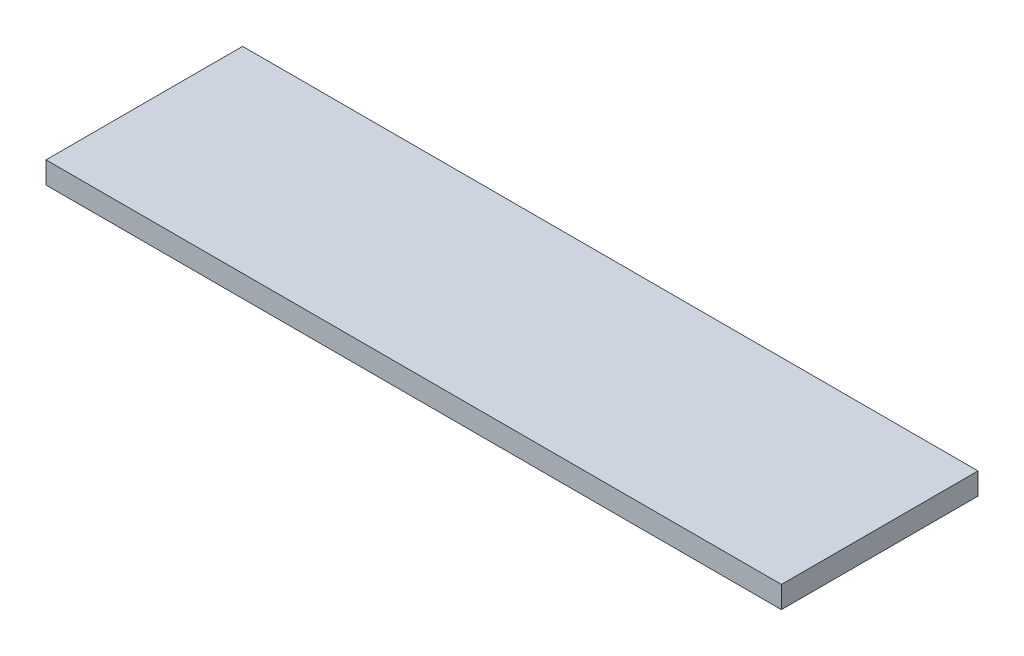
ISO-10303-21;
HEADER;
FILE_DESCRIPTION(('STEP AP214'),'2;1');
FILE_NAME('part.step','',(''),(''),'','','');
FILE_SCHEMA(('AUTOMOTIVE_DESIGN { 1 0 10303 214 1 1 1 1 }'));
ENDSEC;
DATA;
#1=APPLICATION_CONTEXT('core data for automotive mechanical design processes');
#2=APPLICATION_PROTOCOL_DEFINITION('international standard','automotive_design',2000,#1);
#3=PRODUCT_CONTEXT('',#1,'mechanical');
#4=PRODUCT('Part','Part','',(#3));
#5=PRODUCT_RELATED_PRODUCT_CATEGORY('part','',(#4));
#6=PRODUCT_DEFINITION_FORMATION('','',#4);
#7=PRODUCT_DEFINITION_CONTEXT('part definition',#1,'design');
#8=PRODUCT_DEFINITION('design','',#6,#7);
#9=PRODUCT_DEFINITION_SHAPE('','',#8);
#10=(LENGTH_UNIT() NAMED_UNIT(*) SI_UNIT(.MILLI.,.METRE.));
#11=(NAMED_UNIT(*) PLANE_ANGLE_UNIT() SI_UNIT($,.RADIAN.));
#12=(NAMED_UNIT(*) SI_UNIT($,.STERADIAN.) SOLID_ANGLE_UNIT());
#13=UNCERTAINTY_MEASURE_WITH_UNIT(LENGTH_MEASURE(1.E-05),#10,'distance_accuracy_value','');
#14=(GEOMETRIC_REPRESENTATION_CONTEXT(3) GLOBAL_UNCERTAINTY_ASSIGNED_CONTEXT((#13)) GLOBAL_UNIT_ASSIGNED_CONTEXT((#10,
#11,#12)) REPRESENTATION_CONTEXT('',''));
#15=CARTESIAN_POINT('',(0.,0.,0.));
#16=DIRECTION('',(0.,0.,1.));
#17=DIRECTION('',(1.,0.,0.));
#18=AXIS2_PLACEMENT_3D('',#15,#16,#17);
#19=CARTESIAN_POINT('',(1.294995954824,0.644997128945,0.));
#20=DIRECTION('',(1.,0.,0.));
#21=DIRECTION('',(0.,1.,0.));
#22=AXIS2_PLACEMENT_3D('',#19,#20,#21);
#23=PLANE('',#22);
#24=DIRECTION('',(0.,-1.,0.));
#25=VECTOR('',#24,1.);
#26=CARTESIAN_POINT('',(1.294995954824,0.644997128945,0.));
#27=LINE('',#26,#25);
#28=CARTESIAN_POINT('',(1.294995954824,0.644997128945,0.));
#29=VERTEX_POINT('',#28);
#30=CARTESIAN_POINT('',(1.294995954824,0.344997728945,0.));
#31=VERTEX_POINT('',#30);
#32=EDGE_CURVE('E11',#29,#31,#27,.T.);
#33=ORIENTED_EDGE('',*,*,#32,.T.);
#34=DIRECTION('',(0.,0.,1.));
#35=VECTOR('',#34,1.);
#36=CARTESIAN_POINT('',(1.294995954824,0.344997728945,0.));
#37=LINE('',#36,#35);
#38=CARTESIAN_POINT('',(1.294995954824,0.344997728945,2.69999968));
#39=VERTEX_POINT('',#38);
#40=EDGE_CURVE('E25',#31,#39,#37,.T.);
#41=ORIENTED_EDGE('',*,*,#40,.T.);
#42=DIRECTION('',(0.,-1.,0.));
#43=VECTOR('',#42,1.);
#44=CARTESIAN_POINT('',(1.294995954824,0.644997128945,2.69999968));
#45=LINE('',#44,#43);
#46=CARTESIAN_POINT('',(1.294995954824,0.644997128945,2.69999968));
#47=VERTEX_POINT('',#46);
#48=EDGE_CURVE('E106',#47,#39,#45,.T.);
#49=ORIENTED_EDGE('',*,*,#48,.F.);
#50=DIRECTION('',(0.,0.,1.));
#51=VECTOR('',#50,1.);
#52=CARTESIAN_POINT('',(1.294995954824,0.644997128945,0.));
#53=LINE('',#52,#51);
#54=EDGE_CURVE('E87',#29,#47,#53,.T.);
#55=ORIENTED_EDGE('',*,*,#54,.F.);
#56=EDGE_LOOP('',(#33,#41,#49,#55));
#57=FACE_BOUND('',#56,.T.);
#58=ADVANCED_FACE('F17',(#57),#23,.F.);
#59=CARTESIAN_POINT('',(1.294995954824,0.344997728945,0.));
#60=DIRECTION('',(0.,1.,0.));
#61=DIRECTION('',(1.,0.,0.));
#62=AXIS2_PLACEMENT_3D('',#59,#60,#61);
#63=PLANE('',#62);
#64=DIRECTION('',(1.,0.,0.));
#65=VECTOR('',#64,1.);
#66=CARTESIAN_POINT('',(1.294995954824,0.344997728945,0.));
#67=LINE('',#66,#65);
#68=CARTESIAN_POINT('',(11.394998614824,0.344997728945,0.));
#69=VERTEX_POINT('',#68);
#70=EDGE_CURVE('E101',#31,#69,#67,.T.);
#71=ORIENTED_EDGE('',*,*,#70,.T.);
#72=DIRECTION('',(0.,0.,1.));
#73=VECTOR('',#72,1.);
#74=CARTESIAN_POINT('',(11.394998614824,0.344997728945,0.));
#75=LINE('',#74,#73);
#76=CARTESIAN_POINT('',(11.394998614824,0.344997728945,2.69999968));
#77=VERTEX_POINT('',#76);
#78=EDGE_CURVE('E98',#69,#77,#75,.T.);
#79=ORIENTED_EDGE('',*,*,#78,.T.);
#80=DIRECTION('',(1.,0.,0.));
#81=VECTOR('',#80,1.);
#82=CARTESIAN_POINT('',(1.294995954824,0.344997728945,2.69999968));
#83=LINE('',#82,#81);
#84=EDGE_CURVE('E81',#39,#77,#83,.T.);
#85=ORIENTED_EDGE('',*,*,#84,.F.);
#86=ORIENTED_EDGE('',*,*,#40,.F.);
#87=EDGE_LOOP('',(#71,#79,#85,#86));
#88=FACE_BOUND('',#87,.T.);
#89=ADVANCED_FACE('F109',(#88),#63,.F.);
#90=CARTESIAN_POINT('',(11.394998614824,0.344997728945,0.));
#91=DIRECTION('',(-1.,0.,0.));
#92=DIRECTION('',(0.,0.,1.));
#93=AXIS2_PLACEMENT_3D('',#90,#91,#92);
#94=PLANE('',#93);
#95=DIRECTION('',(0.,1.,0.));
#96=VECTOR('',#95,1.);
#97=CARTESIAN_POINT('',(11.394998614824,0.344997728945,0.));
#98=LINE('',#97,#96);
#99=CARTESIAN_POINT('',(11.394998614824,0.644999668945,0.));
#100=VERTEX_POINT('',#99);
#101=EDGE_CURVE('E68',#69,#100,#98,.T.);
#102=ORIENTED_EDGE('',*,*,#101,.T.);
#103=DIRECTION('',(0.,0.,1.));
#104=VECTOR('',#103,1.);
#105=CARTESIAN_POINT('',(11.394998614824,0.644999668945,0.));
#106=LINE('',#105,#104);
#107=CARTESIAN_POINT('',(11.394998614824,0.644999668945,2.69999968));
#108=VERTEX_POINT('',#107);
#109=EDGE_CURVE('E62',#100,#108,#106,.T.);
#110=ORIENTED_EDGE('',*,*,#109,.T.);
#111=DIRECTION('',(0.,1.,0.));
#112=VECTOR('',#111,1.);
#113=CARTESIAN_POINT('',(11.394998614824,0.344997728945,2.69999968));
#114=LINE('',#113,#112);
#115=EDGE_CURVE('E66',#77,#108,#114,.T.);
#116=ORIENTED_EDGE('',*,*,#115,.F.);
#117=ORIENTED_EDGE('',*,*,#78,.F.);
#118=EDGE_LOOP('',(#102,#110,#116,#117));
#119=FACE_BOUND('',#118,.T.);
#120=ADVANCED_FACE('F64',(#119),#94,.F.);
#121=CARTESIAN_POINT('',(11.394998614824,0.644999668945,0.));
#122=DIRECTION('',(2.51485082336592E-07,-0.999999999999968,0.));
#123=DIRECTION('',(0.,0.,-1.));
#124=AXIS2_PLACEMENT_3D('',#121,#122,#123);
#125=PLANE('',#124);
#126=DIRECTION('',(-0.999999999999968,-2.51485082336592E-07,0.));
#127=VECTOR('',#126,1.);
#128=CARTESIAN_POINT('',(11.394998614824,0.644999668945,0.));
#129=LINE('',#128,#127);
#130=EDGE_CURVE('E83',#100,#29,#129,.T.);
#131=ORIENTED_EDGE('',*,*,#130,.T.);
#132=ORIENTED_EDGE('',*,*,#54,.T.);
#133=DIRECTION('',(-0.999999999999968,-2.51485082336592E-07,0.));
#134=VECTOR('',#133,1.);
#135=CARTESIAN_POINT('',(11.394998614824,0.644999668945,2.69999968));
#136=LINE('',#135,#134);
#137=EDGE_CURVE('E79',#108,#47,#136,.T.);
#138=ORIENTED_EDGE('',*,*,#137,.F.);
#139=ORIENTED_EDGE('',*,*,#109,.F.);
#140=EDGE_LOOP('',(#131,#132,#138,#139));
#141=FACE_BOUND('',#140,.T.);
#142=ADVANCED_FACE('F86',(#141),#125,.F.);
#143=CARTESIAN_POINT('',(1.294995954824,0.644997128945,0.));
#144=DIRECTION('',(0.,0.,-1.));
#145=DIRECTION('',(0.,-1.,0.));
#146=AXIS2_PLACEMENT_3D('',#143,#144,#145);
#147=PLANE('',#146);
#148=ORIENTED_EDGE('',*,*,#130,.F.);
#149=ORIENTED_EDGE('',*,*,#101,.F.);
#150=ORIENTED_EDGE('',*,*,#70,.F.);
#151=ORIENTED_EDGE('',*,*,#32,.F.);
#152=EDGE_LOOP('',(#148,#149,#150,#151));
#153=FACE_BOUND('',#152,.T.);
#154=ADVANCED_FACE('F110',(#153),#147,.T.);
#155=CARTESIAN_POINT('',(1.294995954824,0.644997128945,2.69999968));
#156=DIRECTION('',(0.,0.,-1.));
#157=DIRECTION('',(0.,-1.,0.));
#158=AXIS2_PLACEMENT_3D('',#155,#156,#157);
#159=PLANE('',#158);
#160=ORIENTED_EDGE('',*,*,#48,.T.);
#161=ORIENTED_EDGE('',*,*,#84,.T.);
#162=ORIENTED_EDGE('',*,*,#115,.T.);
#163=ORIENTED_EDGE('',*,*,#137,.T.);
#164=EDGE_LOOP('',(#160,#161,#162,#163));
#165=FACE_BOUND('',#164,.T.);
#166=ADVANCED_FACE('F78',(#165),#159,.F.);
#167=CLOSED_SHELL('',(#58,#89,#120,#142,#154,#166));
#168=MANIFOLD_SOLID_BREP('B1',#167);
#169=ADVANCED_BREP_SHAPE_REPRESENTATION('',(#18,#168),#14);
#170=SHAPE_DEFINITION_REPRESENTATION(#9,#169);
ENDSEC;
END-ISO-10303-21;
